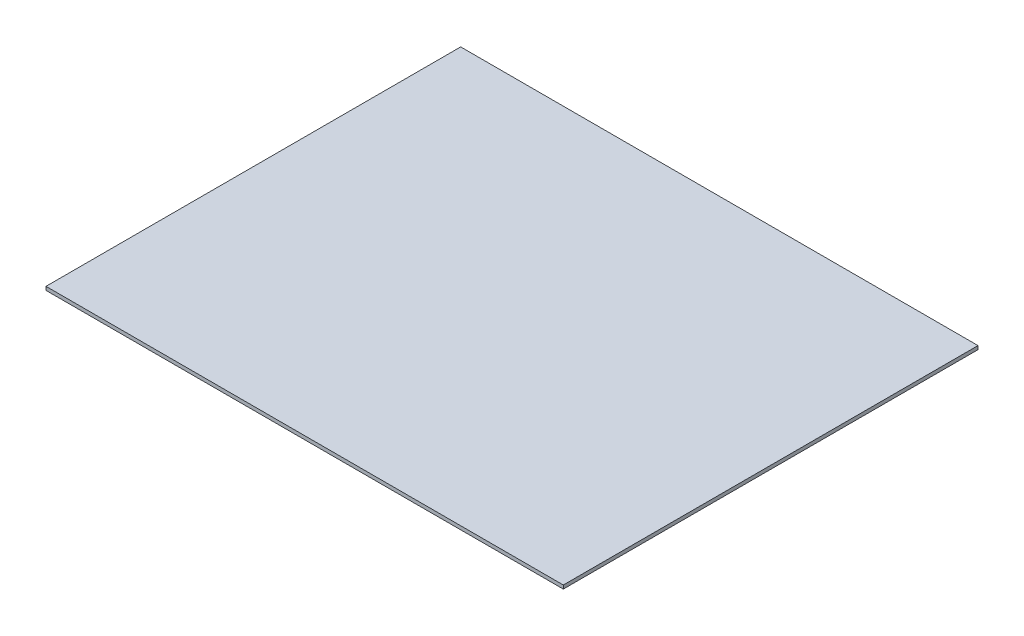
ISO-10303-21;
HEADER;
FILE_DESCRIPTION(('STEP AP214'),'2;1');
FILE_NAME('part.step','',(''),(''),'','','');
FILE_SCHEMA(('AUTOMOTIVE_DESIGN { 1 0 10303 214 1 1 1 1 }'));
ENDSEC;
DATA;
#1=APPLICATION_CONTEXT('core data for automotive mechanical design processes');
#2=APPLICATION_PROTOCOL_DEFINITION('international standard','automotive_design',2000,#1);
#3=PRODUCT_CONTEXT('',#1,'mechanical');
#4=PRODUCT('Part','Part','',(#3));
#5=PRODUCT_RELATED_PRODUCT_CATEGORY('part','',(#4));
#6=PRODUCT_DEFINITION_FORMATION('','',#4);
#7=PRODUCT_DEFINITION_CONTEXT('part definition',#1,'design');
#8=PRODUCT_DEFINITION('design','',#6,#7);
#9=PRODUCT_DEFINITION_SHAPE('','',#8);
#10=(LENGTH_UNIT() NAMED_UNIT(*) SI_UNIT(.MILLI.,.METRE.));
#11=(NAMED_UNIT(*) PLANE_ANGLE_UNIT() SI_UNIT($,.RADIAN.));
#12=(NAMED_UNIT(*) SI_UNIT($,.STERADIAN.) SOLID_ANGLE_UNIT());
#13=UNCERTAINTY_MEASURE_WITH_UNIT(LENGTH_MEASURE(1.E-05),#10,'distance_accuracy_value','');
#14=(GEOMETRIC_REPRESENTATION_CONTEXT(3) GLOBAL_UNCERTAINTY_ASSIGNED_CONTEXT((#13)) GLOBAL_UNIT_ASSIGNED_CONTEXT((#10,
#11,#12)) REPRESENTATION_CONTEXT('',''));
#15=CARTESIAN_POINT('',(0.,0.,0.));
#16=DIRECTION('',(0.,0.,1.));
#17=DIRECTION('',(1.,0.,0.));
#18=AXIS2_PLACEMENT_3D('',#15,#16,#17);
#19=CARTESIAN_POINT('',(123.5,1.7,-99.));
#20=DIRECTION('',(-1.,0.,0.));
#21=DIRECTION('',(0.,0.,1.));
#22=AXIS2_PLACEMENT_3D('',#19,#20,#21);
#23=PLANE('',#22);
#24=DIRECTION('',(0.,0.,-1.));
#25=VECTOR('',#24,1.);
#26=CARTESIAN_POINT('',(123.5,0.,-99.));
#27=LINE('',#26,#25);
#28=CARTESIAN_POINT('',(123.5,0.,99.));
#29=VERTEX_POINT('',#28);
#30=CARTESIAN_POINT('',(123.5,0.,-99.));
#31=VERTEX_POINT('',#30);
#32=EDGE_CURVE('E96',#29,#31,#27,.T.);
#33=ORIENTED_EDGE('',*,*,#32,.T.);
#34=DIRECTION('',(0.,-1.,0.));
#35=VECTOR('',#34,1.);
#36=CARTESIAN_POINT('',(123.5,1.7,-99.));
#37=LINE('',#36,#35);
#38=CARTESIAN_POINT('',(123.5,1.7,-99.));
#39=VERTEX_POINT('',#38);
#40=EDGE_CURVE('E11',#39,#31,#37,.T.);
#41=ORIENTED_EDGE('',*,*,#40,.F.);
#42=DIRECTION('',(0.,0.,-1.));
#43=VECTOR('',#42,1.);
#44=CARTESIAN_POINT('',(123.5,1.7,-99.));
#45=LINE('',#44,#43);
#46=CARTESIAN_POINT('',(123.5,1.7,99.));
#47=VERTEX_POINT('',#46);
#48=EDGE_CURVE('E84',#47,#39,#45,.T.);
#49=ORIENTED_EDGE('',*,*,#48,.F.);
#50=DIRECTION('',(0.,-1.,0.));
#51=VECTOR('',#50,1.);
#52=CARTESIAN_POINT('',(123.5,1.7,99.));
#53=LINE('',#52,#51);
#54=EDGE_CURVE('E92',#47,#29,#53,.T.);
#55=ORIENTED_EDGE('',*,*,#54,.T.);
#56=EDGE_LOOP('',(#33,#41,#49,#55));
#57=FACE_BOUND('',#56,.T.);
#58=ADVANCED_FACE('F33',(#57),#23,.F.);
#59=CARTESIAN_POINT('',(-123.5,1.7,-99.));
#60=DIRECTION('',(0.,0.,1.));
#61=DIRECTION('',(1.,0.,0.));
#62=AXIS2_PLACEMENT_3D('',#59,#60,#61);
#63=PLANE('',#62);
#64=DIRECTION('',(-1.,0.,0.));
#65=VECTOR('',#64,1.);
#66=CARTESIAN_POINT('',(-123.5,0.,-99.));
#67=LINE('',#66,#65);
#68=CARTESIAN_POINT('',(-123.5,0.,-99.));
#69=VERTEX_POINT('',#68);
#70=EDGE_CURVE('E88',#31,#69,#67,.T.);
#71=ORIENTED_EDGE('',*,*,#70,.T.);
#72=DIRECTION('',(0.,-1.,0.));
#73=VECTOR('',#72,1.);
#74=CARTESIAN_POINT('',(-123.5,1.7,-99.));
#75=LINE('',#74,#73);
#76=CARTESIAN_POINT('',(-123.5,1.7,-99.));
#77=VERTEX_POINT('',#76);
#78=EDGE_CURVE('E41',#77,#69,#75,.T.);
#79=ORIENTED_EDGE('',*,*,#78,.F.);
#80=DIRECTION('',(-1.,0.,0.));
#81=VECTOR('',#80,1.);
#82=CARTESIAN_POINT('',(-123.5,1.7,-99.));
#83=LINE('',#82,#81);
#84=EDGE_CURVE('E79',#39,#77,#83,.T.);
#85=ORIENTED_EDGE('',*,*,#84,.F.);
#86=ORIENTED_EDGE('',*,*,#40,.T.);
#87=EDGE_LOOP('',(#71,#79,#85,#86));
#88=FACE_BOUND('',#87,.T.);
#89=ADVANCED_FACE('F87',(#88),#63,.F.);
#90=CARTESIAN_POINT('',(-123.5,1.7,-99.));
#91=DIRECTION('',(1.,0.,0.));
#92=DIRECTION('',(0.,0.,-1.));
#93=AXIS2_PLACEMENT_3D('',#90,#91,#92);
#94=PLANE('',#93);
#95=DIRECTION('',(0.,0.,1.));
#96=VECTOR('',#95,1.);
#97=CARTESIAN_POINT('',(-123.5,0.,-99.));
#98=LINE('',#97,#96);
#99=CARTESIAN_POINT('',(-123.5,0.,99.));
#100=VERTEX_POINT('',#99);
#101=EDGE_CURVE('E66',#69,#100,#98,.T.);
#102=ORIENTED_EDGE('',*,*,#101,.T.);
#103=DIRECTION('',(0.,-1.,0.));
#104=VECTOR('',#103,1.);
#105=CARTESIAN_POINT('',(-123.5,1.7,99.));
#106=LINE('',#105,#104);
#107=CARTESIAN_POINT('',(-123.5,1.7,99.));
#108=VERTEX_POINT('',#107);
#109=EDGE_CURVE('E89',#108,#100,#106,.T.);
#110=ORIENTED_EDGE('',*,*,#109,.F.);
#111=DIRECTION('',(0.,0.,1.));
#112=VECTOR('',#111,1.);
#113=CARTESIAN_POINT('',(-123.5,1.7,-99.));
#114=LINE('',#113,#112);
#115=EDGE_CURVE('E82',#77,#108,#114,.T.);
#116=ORIENTED_EDGE('',*,*,#115,.F.);
#117=ORIENTED_EDGE('',*,*,#78,.T.);
#118=EDGE_LOOP('',(#102,#110,#116,#117));
#119=FACE_BOUND('',#118,.T.);
#120=ADVANCED_FACE('F90',(#119),#94,.F.);
#121=CARTESIAN_POINT('',(-123.5,1.7,99.));
#122=DIRECTION('',(0.,0.,-1.));
#123=DIRECTION('',(-1.,0.,0.));
#124=AXIS2_PLACEMENT_3D('',#121,#122,#123);
#125=PLANE('',#124);
#126=DIRECTION('',(1.,0.,0.));
#127=VECTOR('',#126,1.);
#128=CARTESIAN_POINT('',(-123.5,0.,99.));
#129=LINE('',#128,#127);
#130=EDGE_CURVE('E72',#100,#29,#129,.T.);
#131=ORIENTED_EDGE('',*,*,#130,.T.);
#132=ORIENTED_EDGE('',*,*,#54,.F.);
#133=DIRECTION('',(1.,0.,0.));
#134=VECTOR('',#133,1.);
#135=CARTESIAN_POINT('',(-123.5,1.7,99.));
#136=LINE('',#135,#134);
#137=EDGE_CURVE('E49',#108,#47,#136,.T.);
#138=ORIENTED_EDGE('',*,*,#137,.F.);
#139=ORIENTED_EDGE('',*,*,#109,.T.);
#140=EDGE_LOOP('',(#131,#132,#138,#139));
#141=FACE_BOUND('',#140,.T.);
#142=ADVANCED_FACE('F103',(#141),#125,.F.);
#143=CARTESIAN_POINT('',(0.,1.7,0.));
#144=DIRECTION('',(0.,1.,0.));
#145=DIRECTION('',(0.,0.,1.));
#146=AXIS2_PLACEMENT_3D('',#143,#144,#145);
#147=PLANE('',#146);
#148=ORIENTED_EDGE('',*,*,#48,.T.);
#149=ORIENTED_EDGE('',*,*,#84,.T.);
#150=ORIENTED_EDGE('',*,*,#115,.T.);
#151=ORIENTED_EDGE('',*,*,#137,.T.);
#152=EDGE_LOOP('',(#148,#149,#150,#151));
#153=FACE_BOUND('',#152,.T.);
#154=ADVANCED_FACE('F80',(#153),#147,.T.);
#155=CARTESIAN_POINT('',(0.,0.,0.));
#156=DIRECTION('',(0.,1.,0.));
#157=DIRECTION('',(0.,0.,1.));
#158=AXIS2_PLACEMENT_3D('',#155,#156,#157);
#159=PLANE('',#158);
#160=ORIENTED_EDGE('',*,*,#32,.F.);
#161=ORIENTED_EDGE('',*,*,#130,.F.);
#162=ORIENTED_EDGE('',*,*,#101,.F.);
#163=ORIENTED_EDGE('',*,*,#70,.F.);
#164=EDGE_LOOP('',(#160,#161,#162,#163));
#165=FACE_BOUND('',#164,.T.);
#166=ADVANCED_FACE('F106',(#165),#159,.F.);
#167=CLOSED_SHELL('',(#58,#89,#120,#142,#154,#166));
#168=MANIFOLD_SOLID_BREP('B2',#167);
#169=ADVANCED_BREP_SHAPE_REPRESENTATION('',(#18,#168),#14);
#170=SHAPE_DEFINITION_REPRESENTATION(#9,#169);
ENDSEC;
END-ISO-10303-21;
